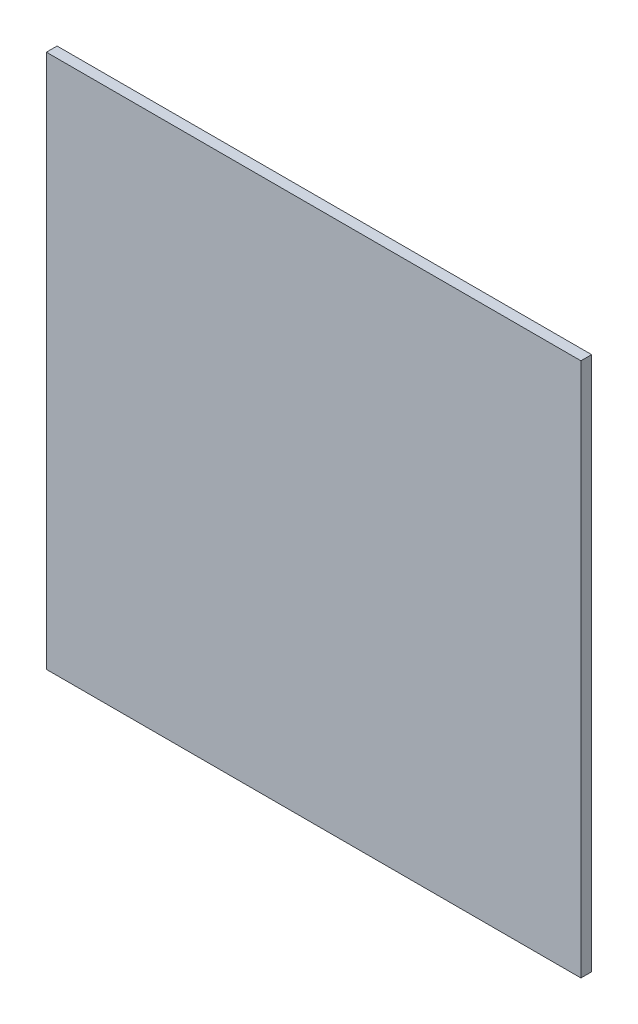
ISO-10303-21;
HEADER;
FILE_DESCRIPTION(('STEP AP214'),'2;1');
FILE_NAME('part.step','',(''),(''),'','','');
FILE_SCHEMA(('AUTOMOTIVE_DESIGN { 1 0 10303 214 1 1 1 1 }'));
ENDSEC;
DATA;
#1=APPLICATION_CONTEXT('core data for automotive mechanical design processes');
#2=APPLICATION_PROTOCOL_DEFINITION('international standard','automotive_design',2000,#1);
#3=PRODUCT_CONTEXT('',#1,'mechanical');
#4=PRODUCT('Part','Part','',(#3));
#5=PRODUCT_RELATED_PRODUCT_CATEGORY('part','',(#4));
#6=PRODUCT_DEFINITION_FORMATION('','',#4);
#7=PRODUCT_DEFINITION_CONTEXT('part definition',#1,'design');
#8=PRODUCT_DEFINITION('design','',#6,#7);
#9=PRODUCT_DEFINITION_SHAPE('','',#8);
#10=(LENGTH_UNIT() NAMED_UNIT(*) SI_UNIT(.MILLI.,.METRE.));
#11=(NAMED_UNIT(*) PLANE_ANGLE_UNIT() SI_UNIT($,.RADIAN.));
#12=(NAMED_UNIT(*) SI_UNIT($,.STERADIAN.) SOLID_ANGLE_UNIT());
#13=UNCERTAINTY_MEASURE_WITH_UNIT(LENGTH_MEASURE(1.E-05),#10,'distance_accuracy_value','');
#14=(GEOMETRIC_REPRESENTATION_CONTEXT(3) GLOBAL_UNCERTAINTY_ASSIGNED_CONTEXT((#13)) GLOBAL_UNIT_ASSIGNED_CONTEXT((#10,
#11,#12)) REPRESENTATION_CONTEXT('',''));
#15=CARTESIAN_POINT('',(0.,0.,0.));
#16=DIRECTION('',(0.,0.,1.));
#17=DIRECTION('',(1.,0.,0.));
#18=AXIS2_PLACEMENT_3D('',#15,#16,#17);
#19=CARTESIAN_POINT('',(125.,125.,5.));
#20=DIRECTION('',(-1.,0.,0.));
#21=DIRECTION('',(0.,-1.,0.));
#22=AXIS2_PLACEMENT_3D('',#19,#20,#21);
#23=PLANE('',#22);
#24=DIRECTION('',(0.,1.,0.));
#25=VECTOR('',#24,1.);
#26=CARTESIAN_POINT('',(125.,125.,0.));
#27=LINE('',#26,#25);
#28=CARTESIAN_POINT('',(125.,-125.,0.));
#29=VERTEX_POINT('',#28);
#30=CARTESIAN_POINT('',(125.,125.,0.));
#31=VERTEX_POINT('',#30);
#32=EDGE_CURVE('E112',#29,#31,#27,.T.);
#33=ORIENTED_EDGE('',*,*,#32,.T.);
#34=DIRECTION('',(0.,0.,-1.));
#35=VECTOR('',#34,1.);
#36=CARTESIAN_POINT('',(125.,125.,5.));
#37=LINE('',#36,#35);
#38=CARTESIAN_POINT('',(125.,125.,5.));
#39=VERTEX_POINT('',#38);
#40=EDGE_CURVE('E11',#39,#31,#37,.T.);
#41=ORIENTED_EDGE('',*,*,#40,.F.);
#42=DIRECTION('',(0.,1.,0.));
#43=VECTOR('',#42,1.);
#44=CARTESIAN_POINT('',(125.,125.,5.));
#45=LINE('',#44,#43);
#46=CARTESIAN_POINT('',(125.,-125.,5.));
#47=VERTEX_POINT('',#46);
#48=EDGE_CURVE('E96',#47,#39,#45,.T.);
#49=ORIENTED_EDGE('',*,*,#48,.F.);
#50=DIRECTION('',(0.,0.,-1.));
#51=VECTOR('',#50,1.);
#52=CARTESIAN_POINT('',(125.,-125.,5.));
#53=LINE('',#52,#51);
#54=EDGE_CURVE('E108',#47,#29,#53,.T.);
#55=ORIENTED_EDGE('',*,*,#54,.T.);
#56=EDGE_LOOP('',(#33,#41,#49,#55));
#57=FACE_BOUND('',#56,.T.);
#58=ADVANCED_FACE('F44',(#57),#23,.F.);
#59=CARTESIAN_POINT('',(-125.,125.,5.));
#60=DIRECTION('',(0.,-1.,0.));
#61=DIRECTION('',(0.,0.,-1.));
#62=AXIS2_PLACEMENT_3D('',#59,#60,#61);
#63=PLANE('',#62);
#64=DIRECTION('',(-1.,0.,0.));
#65=VECTOR('',#64,1.);
#66=CARTESIAN_POINT('',(-125.,125.,0.));
#67=LINE('',#66,#65);
#68=CARTESIAN_POINT('',(-125.,125.,0.));
#69=VERTEX_POINT('',#68);
#70=EDGE_CURVE('E101',#31,#69,#67,.T.);
#71=ORIENTED_EDGE('',*,*,#70,.T.);
#72=DIRECTION('',(0.,0.,-1.));
#73=VECTOR('',#72,1.);
#74=CARTESIAN_POINT('',(-125.,125.,5.));
#75=LINE('',#74,#73);
#76=CARTESIAN_POINT('',(-125.,125.,5.));
#77=VERTEX_POINT('',#76);
#78=EDGE_CURVE('E53',#77,#69,#75,.T.);
#79=ORIENTED_EDGE('',*,*,#78,.F.);
#80=DIRECTION('',(-1.,0.,0.));
#81=VECTOR('',#80,1.);
#82=CARTESIAN_POINT('',(-125.,125.,5.));
#83=LINE('',#82,#81);
#84=EDGE_CURVE('E91',#39,#77,#83,.T.);
#85=ORIENTED_EDGE('',*,*,#84,.F.);
#86=ORIENTED_EDGE('',*,*,#40,.T.);
#87=EDGE_LOOP('',(#71,#79,#85,#86));
#88=FACE_BOUND('',#87,.T.);
#89=ADVANCED_FACE('F100',(#88),#63,.F.);
#90=CARTESIAN_POINT('',(-125.,125.,5.));
#91=DIRECTION('',(1.,0.,0.));
#92=DIRECTION('',(0.,1.,0.));
#93=AXIS2_PLACEMENT_3D('',#90,#91,#92);
#94=PLANE('',#93);
#95=DIRECTION('',(0.,-1.,0.));
#96=VECTOR('',#95,1.);
#97=CARTESIAN_POINT('',(-125.,125.,0.));
#98=LINE('',#97,#96);
#99=CARTESIAN_POINT('',(-125.,-125.,0.));
#100=VERTEX_POINT('',#99);
#101=EDGE_CURVE('E78',#69,#100,#98,.T.);
#102=ORIENTED_EDGE('',*,*,#101,.T.);
#103=DIRECTION('',(0.,0.,-1.));
#104=VECTOR('',#103,1.);
#105=CARTESIAN_POINT('',(-125.,-125.,5.));
#106=LINE('',#105,#104);
#107=CARTESIAN_POINT('',(-125.,-125.,5.));
#108=VERTEX_POINT('',#107);
#109=EDGE_CURVE('E103',#108,#100,#106,.T.);
#110=ORIENTED_EDGE('',*,*,#109,.F.);
#111=DIRECTION('',(0.,-1.,0.));
#112=VECTOR('',#111,1.);
#113=CARTESIAN_POINT('',(-125.,125.,5.));
#114=LINE('',#113,#112);
#115=EDGE_CURVE('E94',#77,#108,#114,.T.);
#116=ORIENTED_EDGE('',*,*,#115,.F.);
#117=ORIENTED_EDGE('',*,*,#78,.T.);
#118=EDGE_LOOP('',(#102,#110,#116,#117));
#119=FACE_BOUND('',#118,.T.);
#120=ADVANCED_FACE('F104',(#119),#94,.F.);
#121=CARTESIAN_POINT('',(-125.,-125.,5.));
#122=DIRECTION('',(0.,1.,0.));
#123=DIRECTION('',(0.,0.,1.));
#124=AXIS2_PLACEMENT_3D('',#121,#122,#123);
#125=PLANE('',#124);
#126=DIRECTION('',(1.,0.,0.));
#127=VECTOR('',#126,1.);
#128=CARTESIAN_POINT('',(-125.,-125.,0.));
#129=LINE('',#128,#127);
#130=EDGE_CURVE('E84',#100,#29,#129,.T.);
#131=ORIENTED_EDGE('',*,*,#130,.T.);
#132=ORIENTED_EDGE('',*,*,#54,.F.);
#133=DIRECTION('',(1.,0.,0.));
#134=VECTOR('',#133,1.);
#135=CARTESIAN_POINT('',(-125.,-125.,5.));
#136=LINE('',#135,#134);
#137=EDGE_CURVE('E61',#108,#47,#136,.T.);
#138=ORIENTED_EDGE('',*,*,#137,.F.);
#139=ORIENTED_EDGE('',*,*,#109,.T.);
#140=EDGE_LOOP('',(#131,#132,#138,#139));
#141=FACE_BOUND('',#140,.T.);
#142=ADVANCED_FACE('F125',(#141),#125,.F.);
#143=CARTESIAN_POINT('',(0.,0.,5.));
#144=DIRECTION('',(0.,0.,1.));
#145=DIRECTION('',(1.,0.,0.));
#146=AXIS2_PLACEMENT_3D('',#143,#144,#145);
#147=PLANE('',#146);
#148=ORIENTED_EDGE('',*,*,#48,.T.);
#149=ORIENTED_EDGE('',*,*,#84,.T.);
#150=ORIENTED_EDGE('',*,*,#115,.T.);
#151=ORIENTED_EDGE('',*,*,#137,.T.);
#152=EDGE_LOOP('',(#148,#149,#150,#151));
#153=FACE_BOUND('',#152,.T.);
#154=ADVANCED_FACE('F92',(#153),#147,.T.);
#155=CARTESIAN_POINT('',(0.,0.,0.));
#156=DIRECTION('',(0.,0.,1.));
#157=DIRECTION('',(1.,0.,0.));
#158=AXIS2_PLACEMENT_3D('',#155,#156,#157);
#159=PLANE('',#158);
#160=ORIENTED_EDGE('',*,*,#32,.F.);
#161=ORIENTED_EDGE('',*,*,#130,.F.);
#162=ORIENTED_EDGE('',*,*,#101,.F.);
#163=ORIENTED_EDGE('',*,*,#70,.F.);
#164=EDGE_LOOP('',(#160,#161,#162,#163));
#165=FACE_BOUND('',#164,.T.);
#166=ADVANCED_FACE('F128',(#165),#159,.F.);
#167=CLOSED_SHELL('',(#58,#89,#120,#142,#154,#166));
#168=MANIFOLD_SOLID_BREP('B2',#167);
#169=ADVANCED_BREP_SHAPE_REPRESENTATION('',(#18,#168),#14);
#170=SHAPE_DEFINITION_REPRESENTATION(#9,#169);
ENDSEC;
END-ISO-10303-21;
